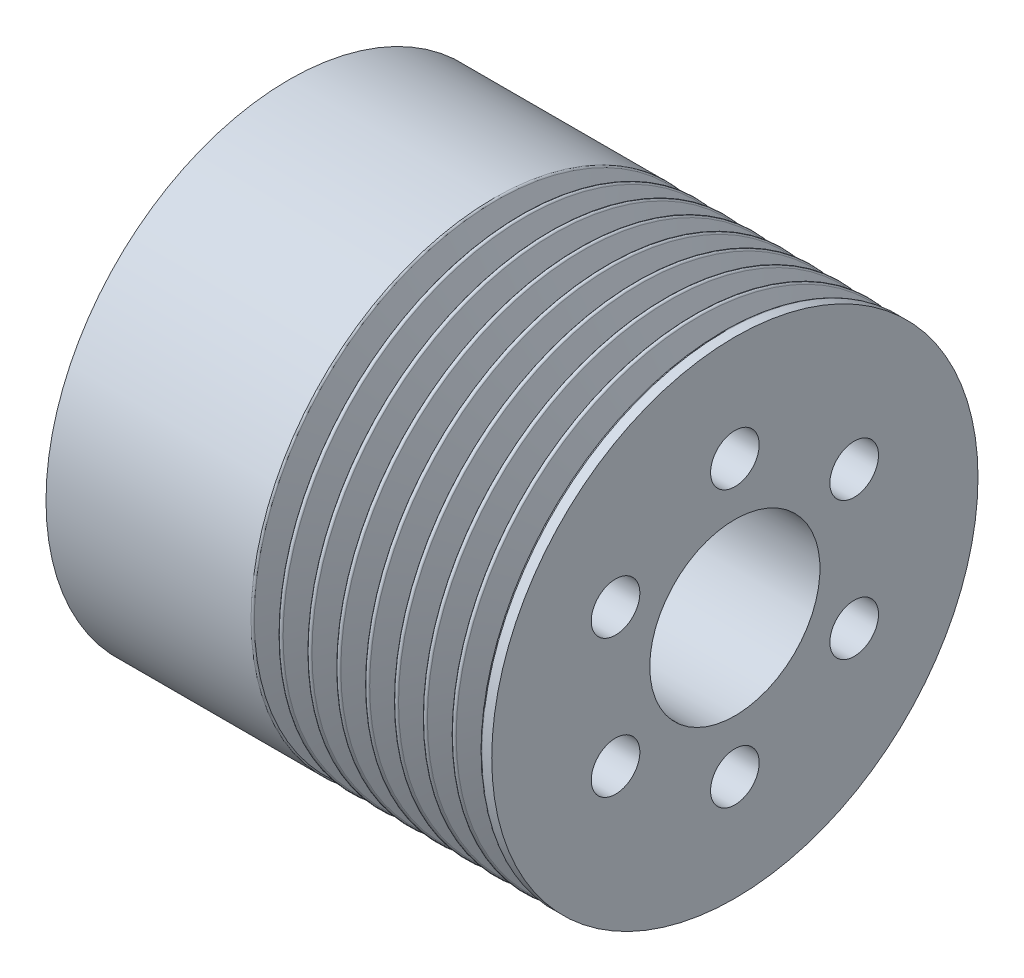
ISO-10303-21;
HEADER;
FILE_DESCRIPTION(('STEP AP214'),'2;1');
FILE_NAME('part.step','',(''),(''),'','','');
FILE_SCHEMA(('AUTOMOTIVE_DESIGN { 1 0 10303 214 1 1 1 1 }'));
ENDSEC;
DATA;
#1=APPLICATION_CONTEXT('core data for automotive mechanical design processes');
#2=APPLICATION_PROTOCOL_DEFINITION('international standard','automotive_design',2000,#1);
#3=PRODUCT_CONTEXT('',#1,'mechanical');
#4=PRODUCT('Part','Part','',(#3));
#5=PRODUCT_RELATED_PRODUCT_CATEGORY('part','',(#4));
#6=PRODUCT_DEFINITION_FORMATION('','',#4);
#7=PRODUCT_DEFINITION_CONTEXT('part definition',#1,'design');
#8=PRODUCT_DEFINITION('design','',#6,#7);
#9=PRODUCT_DEFINITION_SHAPE('','',#8);
#10=(LENGTH_UNIT() NAMED_UNIT(*) SI_UNIT(.MILLI.,.METRE.));
#11=(NAMED_UNIT(*) PLANE_ANGLE_UNIT() SI_UNIT($,.RADIAN.));
#12=(NAMED_UNIT(*) SI_UNIT($,.STERADIAN.) SOLID_ANGLE_UNIT());
#13=UNCERTAINTY_MEASURE_WITH_UNIT(LENGTH_MEASURE(1.E-05),#10,'distance_accuracy_value','');
#14=(GEOMETRIC_REPRESENTATION_CONTEXT(3) GLOBAL_UNCERTAINTY_ASSIGNED_CONTEXT((#13)) GLOBAL_UNIT_ASSIGNED_CONTEXT((#10,
#11,#12)) REPRESENTATION_CONTEXT('',''));
#15=CARTESIAN_POINT('',(0.,0.,0.));
#16=DIRECTION('',(0.,0.,1.));
#17=DIRECTION('',(1.,0.,0.));
#18=AXIS2_PLACEMENT_3D('',#15,#16,#17);
#19=CARTESIAN_POINT('',(0.,0.,0.));
#20=DIRECTION('',(-1.,0.,0.));
#21=DIRECTION('',(0.,0.,1.));
#22=AXIS2_PLACEMENT_3D('',#19,#20,#21);
#23=CYLINDRICAL_SURFACE('',#22,30.);
#24=CARTESIAN_POINT('',(-6.,0.,0.));
#25=DIRECTION('',(-1.,0.,0.));
#26=DIRECTION('',(0.,0.,1.));
#27=AXIS2_PLACEMENT_3D('',#24,#25,#26);
#28=CIRCLE('',#27,30.);
#29=CARTESIAN_POINT('',(-6.,0.,30.));
#30=VERTEX_POINT('',#29);
#31=EDGE_CURVE('E56',#30,#30,#28,.T.);
#32=ORIENTED_EDGE('',*,*,#31,.F.);
#33=EDGE_LOOP('',(#32));
#34=FACE_BOUND('',#33,.T.);
#35=CARTESIAN_POINT('',(19.3,0.,0.));
#36=DIRECTION('',(-1.,0.,0.));
#37=DIRECTION('',(0.,0.,1.));
#38=AXIS2_PLACEMENT_3D('',#35,#36,#37);
#39=CIRCLE('',#38,30.);
#40=CARTESIAN_POINT('',(19.3,0.,30.));
#41=VERTEX_POINT('',#40);
#42=EDGE_CURVE('E207',#41,#41,#39,.T.);
#43=ORIENTED_EDGE('',*,*,#42,.T.);
#44=EDGE_LOOP('',(#43));
#45=FACE_BOUND('',#44,.T.);
#46=ADVANCED_FACE('F43',(#34,#45),#23,.T.);
#47=CARTESIAN_POINT('',(31.5,10.5,0.));
#48=DIRECTION('',(1.,0.,0.));
#49=DIRECTION('',(0.,0.,-1.));
#50=AXIS2_PLACEMENT_3D('',#47,#48,#49);
#51=PLANE('',#50);
#52=CARTESIAN_POINT('',(31.5,8.50000000000017,14.7224318643354));
#53=DIRECTION('',(1.,0.,0.));
#54=DIRECTION('',(0.,0.,-1.));
#55=AXIS2_PLACEMENT_3D('',#52,#53,#54);
#56=CIRCLE('',#55,3.);
#57=CARTESIAN_POINT('',(31.5,8.50000000000017,11.7224318643354));
#58=VERTEX_POINT('',#57);
#59=EDGE_CURVE('E251',#58,#58,#56,.F.);
#60=ORIENTED_EDGE('',*,*,#59,.F.);
#61=EDGE_LOOP('',(#60));
#62=FACE_BOUND('',#61,.T.);
#63=CARTESIAN_POINT('',(31.5,-8.50000000000004,14.7224318643355));
#64=DIRECTION('',(1.,0.,0.));
#65=DIRECTION('',(0.,0.,-1.));
#66=AXIS2_PLACEMENT_3D('',#63,#64,#65);
#67=CIRCLE('',#66,3.);
#68=CARTESIAN_POINT('',(31.5,-8.50000000000004,11.7224318643355));
#69=VERTEX_POINT('',#68);
#70=EDGE_CURVE('E243',#69,#69,#67,.F.);
#71=ORIENTED_EDGE('',*,*,#70,.F.);
#72=EDGE_LOOP('',(#71));
#73=FACE_BOUND('',#72,.T.);
#74=CARTESIAN_POINT('',(31.5,-17.0000000000001,0.));
#75=DIRECTION('',(1.,0.,0.));
#76=DIRECTION('',(0.,0.,-1.));
#77=AXIS2_PLACEMENT_3D('',#74,#75,#76);
#78=CIRCLE('',#77,3.);
#79=CARTESIAN_POINT('',(31.5,-17.0000000000001,-2.99999999999996));
#80=VERTEX_POINT('',#79);
#81=EDGE_CURVE('E235',#80,#80,#78,.F.);
#82=ORIENTED_EDGE('',*,*,#81,.F.);
#83=EDGE_LOOP('',(#82));
#84=FACE_BOUND('',#83,.T.);
#85=CARTESIAN_POINT('',(31.5,-8.49999999999999,-14.7224318643355));
#86=DIRECTION('',(1.,0.,0.));
#87=DIRECTION('',(0.,0.,-1.));
#88=AXIS2_PLACEMENT_3D('',#85,#86,#87);
#89=CIRCLE('',#88,3.);
#90=CARTESIAN_POINT('',(31.5,-8.49999999999999,-17.7224318643355));
#91=VERTEX_POINT('',#90);
#92=EDGE_CURVE('E227',#91,#91,#89,.F.);
#93=ORIENTED_EDGE('',*,*,#92,.F.);
#94=EDGE_LOOP('',(#93));
#95=FACE_BOUND('',#94,.T.);
#96=CARTESIAN_POINT('',(31.5,8.5,-14.7224318643355));
#97=DIRECTION('',(1.,0.,0.));
#98=DIRECTION('',(0.,0.,-1.));
#99=AXIS2_PLACEMENT_3D('',#96,#97,#98);
#100=CIRCLE('',#99,3.);
#101=CARTESIAN_POINT('',(31.5,8.5,-17.7224318643355));
#102=VERTEX_POINT('',#101);
#103=EDGE_CURVE('E219',#102,#102,#100,.F.);
#104=ORIENTED_EDGE('',*,*,#103,.F.);
#105=EDGE_LOOP('',(#104));
#106=FACE_BOUND('',#105,.T.);
#107=CARTESIAN_POINT('',(31.5,17.,0.));
#108=DIRECTION('',(1.,0.,0.));
#109=DIRECTION('',(0.,0.,-1.));
#110=AXIS2_PLACEMENT_3D('',#107,#108,#109);
#111=CIRCLE('',#110,3.);
#112=CARTESIAN_POINT('',(31.5,17.,-3.));
#113=VERTEX_POINT('',#112);
#114=EDGE_CURVE('E211',#113,#113,#111,.F.);
#115=ORIENTED_EDGE('',*,*,#114,.F.);
#116=EDGE_LOOP('',(#115));
#117=FACE_BOUND('',#116,.T.);
#118=CARTESIAN_POINT('',(31.5,0.,0.));
#119=DIRECTION('',(-1.,0.,0.));
#120=DIRECTION('',(0.,0.,1.));
#121=AXIS2_PLACEMENT_3D('',#118,#119,#120);
#122=CIRCLE('',#121,10.5);
#123=CARTESIAN_POINT('',(31.5,0.,10.5));
#124=VERTEX_POINT('',#123);
#125=EDGE_CURVE('E71',#124,#124,#122,.T.);
#126=ORIENTED_EDGE('',*,*,#125,.F.);
#127=EDGE_LOOP('',(#126));
#128=FACE_BOUND('',#127,.T.);
#129=CARTESIAN_POINT('',(31.5,0.,0.));
#130=DIRECTION('',(-1.,0.,0.));
#131=DIRECTION('',(0.,0.,1.));
#132=AXIS2_PLACEMENT_3D('',#129,#130,#131);
#133=CIRCLE('',#132,21.5);
#134=CARTESIAN_POINT('',(31.5,0.,21.5));
#135=VERTEX_POINT('',#134);
#136=EDGE_CURVE('E10',#135,#135,#133,.T.);
#137=ORIENTED_EDGE('',*,*,#136,.T.);
#138=EDGE_LOOP('',(#137));
#139=FACE_BOUND('',#138,.T.);
#140=ADVANCED_FACE('F45',(#62,#73,#84,#95,#106,#117,#128,#139),#51,.F.);
#141=CARTESIAN_POINT('',(0.,0.,0.));
#142=DIRECTION('',(-1.,0.,0.));
#143=DIRECTION('',(0.,0.,1.));
#144=AXIS2_PLACEMENT_3D('',#141,#142,#143);
#145=CYLINDRICAL_SURFACE('',#144,21.5);
#146=ORIENTED_EDGE('',*,*,#136,.F.);
#147=EDGE_LOOP('',(#146));
#148=FACE_BOUND('',#147,.T.);
#149=CARTESIAN_POINT('',(-6.,0.,0.));
#150=DIRECTION('',(-1.,0.,0.));
#151=DIRECTION('',(0.,0.,1.));
#152=AXIS2_PLACEMENT_3D('',#149,#150,#151);
#153=CIRCLE('',#152,21.5);
#154=CARTESIAN_POINT('',(-6.,0.,21.5));
#155=VERTEX_POINT('',#154);
#156=EDGE_CURVE('E51',#155,#155,#153,.T.);
#157=ORIENTED_EDGE('',*,*,#156,.T.);
#158=EDGE_LOOP('',(#157));
#159=FACE_BOUND('',#158,.T.);
#160=ADVANCED_FACE('F289',(#148,#159),#145,.F.);
#161=CARTESIAN_POINT('',(-6.,30.,0.));
#162=DIRECTION('',(1.,0.,0.));
#163=DIRECTION('',(0.,0.,-1.));
#164=AXIS2_PLACEMENT_3D('',#161,#162,#163);
#165=PLANE('',#164);
#166=ORIENTED_EDGE('',*,*,#156,.F.);
#167=EDGE_LOOP('',(#166));
#168=FACE_BOUND('',#167,.T.);
#169=ORIENTED_EDGE('',*,*,#31,.T.);
#170=EDGE_LOOP('',(#169));
#171=FACE_BOUND('',#170,.T.);
#172=ADVANCED_FACE('F295',(#168,#171),#165,.F.);
#173=CARTESIAN_POINT('',(47.78,0.,0.));
#174=DIRECTION('',(-1.,0.,0.));
#175=DIRECTION('',(0.,0.,1.));
#176=AXIS2_PLACEMENT_3D('',#173,#174,#175);
#177=CIRCLE('',#176,30.);
#178=CARTESIAN_POINT('',(47.78,0.,30.));
#179=VERTEX_POINT('',#178);
#180=EDGE_CURVE('E91',#179,#179,#177,.T.);
#181=ORIENTED_EDGE('',*,*,#180,.F.);
#182=EDGE_LOOP('',(#181));
#183=FACE_BOUND('',#182,.T.);
#184=CARTESIAN_POINT('',(49.,0.,0.));
#185=DIRECTION('',(-1.,0.,0.));
#186=DIRECTION('',(0.,0.,1.));
#187=AXIS2_PLACEMENT_3D('',#184,#185,#186);
#188=CIRCLE('',#187,30.);
#189=CARTESIAN_POINT('',(49.,0.,30.));
#190=VERTEX_POINT('',#189);
#191=EDGE_CURVE('E61',#190,#190,#188,.T.);
#192=ORIENTED_EDGE('',*,*,#191,.T.);
#193=EDGE_LOOP('',(#192));
#194=FACE_BOUND('',#193,.T.);
#195=ADVANCED_FACE('F266',(#183,#194),#23,.T.);
#196=CARTESIAN_POINT('',(49.,10.5,0.));
#197=DIRECTION('',(-1.,0.,0.));
#198=DIRECTION('',(0.,0.,1.));
#199=AXIS2_PLACEMENT_3D('',#196,#197,#198);
#200=PLANE('',#199);
#201=CARTESIAN_POINT('',(49.,8.50000000000017,14.7224318643354));
#202=DIRECTION('',(1.,0.,0.));
#203=DIRECTION('',(0.,0.,-1.));
#204=AXIS2_PLACEMENT_3D('',#201,#202,#203);
#205=CIRCLE('',#204,3.);
#206=CARTESIAN_POINT('',(49.,8.50000000000017,11.7224318643354));
#207=VERTEX_POINT('',#206);
#208=EDGE_CURVE('E255',#207,#207,#205,.T.);
#209=ORIENTED_EDGE('',*,*,#208,.F.);
#210=EDGE_LOOP('',(#209));
#211=FACE_BOUND('',#210,.T.);
#212=CARTESIAN_POINT('',(49.,-8.50000000000004,14.7224318643355));
#213=DIRECTION('',(1.,0.,0.));
#214=DIRECTION('',(0.,0.,-1.));
#215=AXIS2_PLACEMENT_3D('',#212,#213,#214);
#216=CIRCLE('',#215,3.);
#217=CARTESIAN_POINT('',(49.,-8.50000000000004,11.7224318643355));
#218=VERTEX_POINT('',#217);
#219=EDGE_CURVE('E247',#218,#218,#216,.T.);
#220=ORIENTED_EDGE('',*,*,#219,.F.);
#221=EDGE_LOOP('',(#220));
#222=FACE_BOUND('',#221,.T.);
#223=CARTESIAN_POINT('',(49.,-17.0000000000001,0.));
#224=DIRECTION('',(1.,0.,0.));
#225=DIRECTION('',(0.,0.,-1.));
#226=AXIS2_PLACEMENT_3D('',#223,#224,#225);
#227=CIRCLE('',#226,3.);
#228=CARTESIAN_POINT('',(49.,-17.0000000000001,-2.99999999999996));
#229=VERTEX_POINT('',#228);
#230=EDGE_CURVE('E239',#229,#229,#227,.T.);
#231=ORIENTED_EDGE('',*,*,#230,.F.);
#232=EDGE_LOOP('',(#231));
#233=FACE_BOUND('',#232,.T.);
#234=CARTESIAN_POINT('',(49.,-8.49999999999999,-14.7224318643355));
#235=DIRECTION('',(1.,0.,0.));
#236=DIRECTION('',(0.,0.,-1.));
#237=AXIS2_PLACEMENT_3D('',#234,#235,#236);
#238=CIRCLE('',#237,3.);
#239=CARTESIAN_POINT('',(49.,-8.49999999999999,-17.7224318643355));
#240=VERTEX_POINT('',#239);
#241=EDGE_CURVE('E231',#240,#240,#238,.T.);
#242=ORIENTED_EDGE('',*,*,#241,.F.);
#243=EDGE_LOOP('',(#242));
#244=FACE_BOUND('',#243,.T.);
#245=CARTESIAN_POINT('',(49.,8.5,-14.7224318643355));
#246=DIRECTION('',(1.,0.,0.));
#247=DIRECTION('',(0.,0.,-1.));
#248=AXIS2_PLACEMENT_3D('',#245,#246,#247);
#249=CIRCLE('',#248,3.);
#250=CARTESIAN_POINT('',(49.,8.5,-17.7224318643355));
#251=VERTEX_POINT('',#250);
#252=EDGE_CURVE('E223',#251,#251,#249,.T.);
#253=ORIENTED_EDGE('',*,*,#252,.F.);
#254=EDGE_LOOP('',(#253));
#255=FACE_BOUND('',#254,.T.);
#256=CARTESIAN_POINT('',(49.,17.,0.));
#257=DIRECTION('',(1.,0.,0.));
#258=DIRECTION('',(0.,0.,-1.));
#259=AXIS2_PLACEMENT_3D('',#256,#257,#258);
#260=CIRCLE('',#259,3.);
#261=CARTESIAN_POINT('',(49.,17.,-3.));
#262=VERTEX_POINT('',#261);
#263=EDGE_CURVE('E215',#262,#262,#260,.T.);
#264=ORIENTED_EDGE('',*,*,#263,.F.);
#265=EDGE_LOOP('',(#264));
#266=FACE_BOUND('',#265,.T.);
#267=ORIENTED_EDGE('',*,*,#191,.F.);
#268=EDGE_LOOP('',(#267));
#269=FACE_BOUND('',#268,.T.);
#270=CARTESIAN_POINT('',(49.,0.,0.));
#271=DIRECTION('',(-1.,0.,0.));
#272=DIRECTION('',(0.,0.,1.));
#273=AXIS2_PLACEMENT_3D('',#270,#271,#272);
#274=CIRCLE('',#273,10.5);
#275=CARTESIAN_POINT('',(49.,0.,10.5));
#276=VERTEX_POINT('',#275);
#277=EDGE_CURVE('E67',#276,#276,#274,.T.);
#278=ORIENTED_EDGE('',*,*,#277,.T.);
#279=EDGE_LOOP('',(#278));
#280=FACE_BOUND('',#279,.T.);
#281=ADVANCED_FACE('F262',(#211,#222,#233,#244,#255,#266,#269,#280),#200,.F.);
#282=CARTESIAN_POINT('',(0.,0.,0.));
#283=DIRECTION('',(-1.,0.,0.));
#284=DIRECTION('',(0.,0.,1.));
#285=AXIS2_PLACEMENT_3D('',#282,#283,#284);
#286=CYLINDRICAL_SURFACE('',#285,10.5);
#287=ORIENTED_EDGE('',*,*,#277,.F.);
#288=EDGE_LOOP('',(#287));
#289=FACE_BOUND('',#288,.T.);
#290=ORIENTED_EDGE('',*,*,#125,.T.);
#291=EDGE_LOOP('',(#290));
#292=FACE_BOUND('',#291,.T.);
#293=ADVANCED_FACE('F265',(#289,#292),#286,.F.);
#294=CARTESIAN_POINT('',(47.78,0.,0.));
#295=DIRECTION('',(-1.,0.,0.));
#296=DIRECTION('',(0.,0.,1.));
#297=AXIS2_PLACEMENT_3D('',#294,#295,#296);
#298=TOROIDAL_SURFACE('',#297,29.75,0.250000000000001);
#299=ORIENTED_EDGE('',*,*,#180,.T.);
#300=EDGE_LOOP('',(#299));
#301=FACE_BOUND('',#300,.T.);
#302=CARTESIAN_POINT('',(47.5450768448035,0.,0.));
#303=DIRECTION('',(-1.,0.,0.));
#304=DIRECTION('',(0.,0.,1.));
#305=AXIS2_PLACEMENT_3D('',#302,#303,#304);
#306=CIRCLE('',#305,29.8355050358314);
#307=CARTESIAN_POINT('',(47.5450768448035,0.,29.8355050358314));
#308=VERTEX_POINT('',#307);
#309=EDGE_CURVE('E75',#308,#308,#306,.T.);
#310=ORIENTED_EDGE('',*,*,#309,.F.);
#311=EDGE_LOOP('',(#310));
#312=FACE_BOUND('',#311,.T.);
#313=ADVANCED_FACE('F284',(#301,#312),#298,.T.);
#314=CARTESIAN_POINT('',(46.2819077862358,0.,0.));
#315=DIRECTION('',(1.,0.,0.));
#316=DIRECTION('',(0.,0.,-1.));
#317=AXIS2_PLACEMENT_3D('',#314,#315,#316);
#318=CONICAL_SURFACE('',#317,26.3649765704627,1.22173047639603);
#319=ORIENTED_EDGE('',*,*,#309,.T.);
#320=EDGE_LOOP('',(#319));
#321=FACE_BOUND('',#320,.T.);
#322=CARTESIAN_POINT('',(46.2819077862358,0.,0.));
#323=DIRECTION('',(-1.,0.,0.));
#324=DIRECTION('',(0.,0.,1.));
#325=AXIS2_PLACEMENT_3D('',#322,#323,#324);
#326=CIRCLE('',#325,26.3649765704627);
#327=CARTESIAN_POINT('',(46.2819077862358,0.,26.3649765704627));
#328=VERTEX_POINT('',#327);
#329=EDGE_CURVE('E79',#328,#328,#326,.T.);
#330=ORIENTED_EDGE('',*,*,#329,.F.);
#331=EDGE_LOOP('',(#330));
#332=FACE_BOUND('',#331,.T.);
#333=ADVANCED_FACE('F447',(#321,#332),#318,.T.);
#334=CARTESIAN_POINT('',(46.,0.,0.));
#335=DIRECTION('',(-1.,0.,0.));
#336=DIRECTION('',(0.,0.,1.));
#337=AXIS2_PLACEMENT_3D('',#334,#335,#336);
#338=TOROIDAL_SURFACE('',#337,26.4675826134604,0.3);
#339=ORIENTED_EDGE('',*,*,#329,.T.);
#340=EDGE_LOOP('',(#339));
#341=FACE_BOUND('',#340,.T.);
#342=CARTESIAN_POINT('',(45.7180922137642,0.,0.));
#343=DIRECTION('',(-1.,0.,0.));
#344=DIRECTION('',(0.,0.,1.));
#345=AXIS2_PLACEMENT_3D('',#342,#343,#344);
#346=CIRCLE('',#345,26.3649765704627);
#347=CARTESIAN_POINT('',(45.7180922137642,0.,26.3649765704627));
#348=VERTEX_POINT('',#347);
#349=EDGE_CURVE('E83',#348,#348,#346,.T.);
#350=ORIENTED_EDGE('',*,*,#349,.F.);
#351=EDGE_LOOP('',(#350));
#352=FACE_BOUND('',#351,.T.);
#353=ADVANCED_FACE('F443',(#341,#352),#338,.F.);
#354=CARTESIAN_POINT('',(44.4549231551965,0.,0.));
#355=DIRECTION('',(-1.,0.,0.));
#356=DIRECTION('',(0.,0.,1.));
#357=AXIS2_PLACEMENT_3D('',#354,#355,#356);
#358=CONICAL_SURFACE('',#357,29.8355050358314,1.22173047639604);
#359=ORIENTED_EDGE('',*,*,#349,.T.);
#360=EDGE_LOOP('',(#359));
#361=FACE_BOUND('',#360,.T.);
#362=CARTESIAN_POINT('',(44.4549231551965,0.,0.));
#363=DIRECTION('',(-1.,0.,0.));
#364=DIRECTION('',(0.,0.,1.));
#365=AXIS2_PLACEMENT_3D('',#362,#363,#364);
#366=CIRCLE('',#365,29.8355050358314);
#367=CARTESIAN_POINT('',(44.4549231551965,0.,29.8355050358314));
#368=VERTEX_POINT('',#367);
#369=EDGE_CURVE('E87',#368,#368,#366,.T.);
#370=ORIENTED_EDGE('',*,*,#369,.F.);
#371=EDGE_LOOP('',(#370));
#372=FACE_BOUND('',#371,.T.);
#373=ADVANCED_FACE('F439',(#361,#372),#358,.T.);
#374=CARTESIAN_POINT('',(44.22,0.,0.));
#375=DIRECTION('',(-1.,0.,0.));
#376=DIRECTION('',(0.,0.,1.));
#377=AXIS2_PLACEMENT_3D('',#374,#375,#376);
#378=TOROIDAL_SURFACE('',#377,29.75,0.250000000000001);
#379=ORIENTED_EDGE('',*,*,#369,.T.);
#380=EDGE_LOOP('',(#379));
#381=FACE_BOUND('',#380,.T.);
#382=CARTESIAN_POINT('',(43.9850768448035,0.,0.));
#383=DIRECTION('',(-1.,0.,0.));
#384=DIRECTION('',(0.,0.,1.));
#385=AXIS2_PLACEMENT_3D('',#382,#383,#384);
#386=CIRCLE('',#385,29.8355050358314);
#387=CARTESIAN_POINT('',(43.9850768448035,0.,29.8355050358314));
#388=VERTEX_POINT('',#387);
#389=EDGE_CURVE('E95',#388,#388,#386,.T.);
#390=ORIENTED_EDGE('',*,*,#389,.F.);
#391=EDGE_LOOP('',(#390));
#392=FACE_BOUND('',#391,.T.);
#393=ADVANCED_FACE('F435',(#381,#392),#378,.T.);
#394=CARTESIAN_POINT('',(42.7219077862358,0.,0.));
#395=DIRECTION('',(1.,0.,0.));
#396=DIRECTION('',(0.,0.,-1.));
#397=AXIS2_PLACEMENT_3D('',#394,#395,#396);
#398=CONICAL_SURFACE('',#397,26.3649765704627,1.22173047639603);
#399=ORIENTED_EDGE('',*,*,#389,.T.);
#400=EDGE_LOOP('',(#399));
#401=FACE_BOUND('',#400,.T.);
#402=CARTESIAN_POINT('',(42.7219077862358,0.,0.));
#403=DIRECTION('',(-1.,0.,0.));
#404=DIRECTION('',(0.,0.,1.));
#405=AXIS2_PLACEMENT_3D('',#402,#403,#404);
#406=CIRCLE('',#405,26.3649765704627);
#407=CARTESIAN_POINT('',(42.7219077862358,0.,26.3649765704627));
#408=VERTEX_POINT('',#407);
#409=EDGE_CURVE('E99',#408,#408,#406,.T.);
#410=ORIENTED_EDGE('',*,*,#409,.F.);
#411=EDGE_LOOP('',(#410));
#412=FACE_BOUND('',#411,.T.);
#413=ADVANCED_FACE('F431',(#401,#412),#398,.T.);
#414=CARTESIAN_POINT('',(42.44,0.,0.));
#415=DIRECTION('',(-1.,0.,0.));
#416=DIRECTION('',(0.,0.,1.));
#417=AXIS2_PLACEMENT_3D('',#414,#415,#416);
#418=TOROIDAL_SURFACE('',#417,26.4675826134604,0.3);
#419=ORIENTED_EDGE('',*,*,#409,.T.);
#420=EDGE_LOOP('',(#419));
#421=FACE_BOUND('',#420,.T.);
#422=CARTESIAN_POINT('',(42.1580922137642,0.,0.));
#423=DIRECTION('',(-1.,0.,0.));
#424=DIRECTION('',(0.,0.,1.));
#425=AXIS2_PLACEMENT_3D('',#422,#423,#424);
#426=CIRCLE('',#425,26.3649765704627);
#427=CARTESIAN_POINT('',(42.1580922137642,0.,26.3649765704627));
#428=VERTEX_POINT('',#427);
#429=EDGE_CURVE('E103',#428,#428,#426,.T.);
#430=ORIENTED_EDGE('',*,*,#429,.F.);
#431=EDGE_LOOP('',(#430));
#432=FACE_BOUND('',#431,.T.);
#433=ADVANCED_FACE('F427',(#421,#432),#418,.F.);
#434=CARTESIAN_POINT('',(40.8949231551965,0.,0.));
#435=DIRECTION('',(-1.,0.,0.));
#436=DIRECTION('',(0.,0.,1.));
#437=AXIS2_PLACEMENT_3D('',#434,#435,#436);
#438=CONICAL_SURFACE('',#437,29.8355050358314,1.22173047639604);
#439=ORIENTED_EDGE('',*,*,#429,.T.);
#440=EDGE_LOOP('',(#439));
#441=FACE_BOUND('',#440,.T.);
#442=CARTESIAN_POINT('',(40.8949231551965,0.,0.));
#443=DIRECTION('',(-1.,0.,0.));
#444=DIRECTION('',(0.,0.,1.));
#445=AXIS2_PLACEMENT_3D('',#442,#443,#444);
#446=CIRCLE('',#445,29.8355050358314);
#447=CARTESIAN_POINT('',(40.8949231551965,0.,29.8355050358314));
#448=VERTEX_POINT('',#447);
#449=EDGE_CURVE('E107',#448,#448,#446,.T.);
#450=ORIENTED_EDGE('',*,*,#449,.F.);
#451=EDGE_LOOP('',(#450));
#452=FACE_BOUND('',#451,.T.);
#453=ADVANCED_FACE('F423',(#441,#452),#438,.T.);
#454=CARTESIAN_POINT('',(40.66,0.,0.));
#455=DIRECTION('',(-1.,0.,0.));
#456=DIRECTION('',(0.,0.,1.));
#457=AXIS2_PLACEMENT_3D('',#454,#455,#456);
#458=TOROIDAL_SURFACE('',#457,29.75,0.250000000000001);
#459=ORIENTED_EDGE('',*,*,#449,.T.);
#460=EDGE_LOOP('',(#459));
#461=FACE_BOUND('',#460,.T.);
#462=CARTESIAN_POINT('',(40.4250768448035,0.,0.));
#463=DIRECTION('',(-1.,0.,0.));
#464=DIRECTION('',(0.,0.,1.));
#465=AXIS2_PLACEMENT_3D('',#462,#463,#464);
#466=CIRCLE('',#465,29.8355050358314);
#467=CARTESIAN_POINT('',(40.4250768448035,0.,29.8355050358314));
#468=VERTEX_POINT('',#467);
#469=EDGE_CURVE('E111',#468,#468,#466,.T.);
#470=ORIENTED_EDGE('',*,*,#469,.F.);
#471=EDGE_LOOP('',(#470));
#472=FACE_BOUND('',#471,.T.);
#473=ADVANCED_FACE('F419',(#461,#472),#458,.T.);
#474=CARTESIAN_POINT('',(39.1619077862358,0.,0.));
#475=DIRECTION('',(1.,0.,0.));
#476=DIRECTION('',(0.,0.,-1.));
#477=AXIS2_PLACEMENT_3D('',#474,#475,#476);
#478=CONICAL_SURFACE('',#477,26.3649765704627,1.22173047639603);
#479=ORIENTED_EDGE('',*,*,#469,.T.);
#480=EDGE_LOOP('',(#479));
#481=FACE_BOUND('',#480,.T.);
#482=CARTESIAN_POINT('',(39.1619077862358,0.,0.));
#483=DIRECTION('',(-1.,0.,0.));
#484=DIRECTION('',(0.,0.,1.));
#485=AXIS2_PLACEMENT_3D('',#482,#483,#484);
#486=CIRCLE('',#485,26.3649765704627);
#487=CARTESIAN_POINT('',(39.1619077862358,0.,26.3649765704627));
#488=VERTEX_POINT('',#487);
#489=EDGE_CURVE('E115',#488,#488,#486,.T.);
#490=ORIENTED_EDGE('',*,*,#489,.F.);
#491=EDGE_LOOP('',(#490));
#492=FACE_BOUND('',#491,.T.);
#493=ADVANCED_FACE('F415',(#481,#492),#478,.T.);
#494=CARTESIAN_POINT('',(38.88,0.,0.));
#495=DIRECTION('',(-1.,0.,0.));
#496=DIRECTION('',(0.,0.,1.));
#497=AXIS2_PLACEMENT_3D('',#494,#495,#496);
#498=TOROIDAL_SURFACE('',#497,26.4675826134604,0.3);
#499=ORIENTED_EDGE('',*,*,#489,.T.);
#500=EDGE_LOOP('',(#499));
#501=FACE_BOUND('',#500,.T.);
#502=CARTESIAN_POINT('',(38.5980922137642,0.,0.));
#503=DIRECTION('',(-1.,0.,0.));
#504=DIRECTION('',(0.,0.,1.));
#505=AXIS2_PLACEMENT_3D('',#502,#503,#504);
#506=CIRCLE('',#505,26.3649765704627);
#507=CARTESIAN_POINT('',(38.5980922137642,0.,26.3649765704627));
#508=VERTEX_POINT('',#507);
#509=EDGE_CURVE('E119',#508,#508,#506,.T.);
#510=ORIENTED_EDGE('',*,*,#509,.F.);
#511=EDGE_LOOP('',(#510));
#512=FACE_BOUND('',#511,.T.);
#513=ADVANCED_FACE('F411',(#501,#512),#498,.F.);
#514=CARTESIAN_POINT('',(37.3349231551965,0.,0.));
#515=DIRECTION('',(-1.,0.,0.));
#516=DIRECTION('',(0.,0.,1.));
#517=AXIS2_PLACEMENT_3D('',#514,#515,#516);
#518=CONICAL_SURFACE('',#517,29.8355050358314,1.22173047639604);
#519=ORIENTED_EDGE('',*,*,#509,.T.);
#520=EDGE_LOOP('',(#519));
#521=FACE_BOUND('',#520,.T.);
#522=CARTESIAN_POINT('',(37.3349231551965,0.,0.));
#523=DIRECTION('',(-1.,0.,0.));
#524=DIRECTION('',(0.,0.,1.));
#525=AXIS2_PLACEMENT_3D('',#522,#523,#524);
#526=CIRCLE('',#525,29.8355050358314);
#527=CARTESIAN_POINT('',(37.3349231551965,0.,29.8355050358314));
#528=VERTEX_POINT('',#527);
#529=EDGE_CURVE('E123',#528,#528,#526,.T.);
#530=ORIENTED_EDGE('',*,*,#529,.F.);
#531=EDGE_LOOP('',(#530));
#532=FACE_BOUND('',#531,.T.);
#533=ADVANCED_FACE('F407',(#521,#532),#518,.T.);
#534=CARTESIAN_POINT('',(37.1,0.,0.));
#535=DIRECTION('',(-1.,0.,0.));
#536=DIRECTION('',(0.,0.,1.));
#537=AXIS2_PLACEMENT_3D('',#534,#535,#536);
#538=TOROIDAL_SURFACE('',#537,29.75,0.250000000000001);
#539=ORIENTED_EDGE('',*,*,#529,.T.);
#540=EDGE_LOOP('',(#539));
#541=FACE_BOUND('',#540,.T.);
#542=CARTESIAN_POINT('',(36.8650768448035,0.,0.));
#543=DIRECTION('',(-1.,0.,0.));
#544=DIRECTION('',(0.,0.,1.));
#545=AXIS2_PLACEMENT_3D('',#542,#543,#544);
#546=CIRCLE('',#545,29.8355050358314);
#547=CARTESIAN_POINT('',(36.8650768448035,0.,29.8355050358314));
#548=VERTEX_POINT('',#547);
#549=EDGE_CURVE('E127',#548,#548,#546,.T.);
#550=ORIENTED_EDGE('',*,*,#549,.F.);
#551=EDGE_LOOP('',(#550));
#552=FACE_BOUND('',#551,.T.);
#553=ADVANCED_FACE('F403',(#541,#552),#538,.T.);
#554=CARTESIAN_POINT('',(35.6019077862358,0.,0.));
#555=DIRECTION('',(1.,0.,0.));
#556=DIRECTION('',(0.,0.,-1.));
#557=AXIS2_PLACEMENT_3D('',#554,#555,#556);
#558=CONICAL_SURFACE('',#557,26.3649765704627,1.22173047639603);
#559=ORIENTED_EDGE('',*,*,#549,.T.);
#560=EDGE_LOOP('',(#559));
#561=FACE_BOUND('',#560,.T.);
#562=CARTESIAN_POINT('',(35.6019077862358,0.,0.));
#563=DIRECTION('',(-1.,0.,0.));
#564=DIRECTION('',(0.,0.,1.));
#565=AXIS2_PLACEMENT_3D('',#562,#563,#564);
#566=CIRCLE('',#565,26.3649765704627);
#567=CARTESIAN_POINT('',(35.6019077862358,0.,26.3649765704627));
#568=VERTEX_POINT('',#567);
#569=EDGE_CURVE('E131',#568,#568,#566,.T.);
#570=ORIENTED_EDGE('',*,*,#569,.F.);
#571=EDGE_LOOP('',(#570));
#572=FACE_BOUND('',#571,.T.);
#573=ADVANCED_FACE('F399',(#561,#572),#558,.T.);
#574=CARTESIAN_POINT('',(35.32,0.,0.));
#575=DIRECTION('',(-1.,0.,0.));
#576=DIRECTION('',(0.,0.,1.));
#577=AXIS2_PLACEMENT_3D('',#574,#575,#576);
#578=TOROIDAL_SURFACE('',#577,26.4675826134604,0.3);
#579=ORIENTED_EDGE('',*,*,#569,.T.);
#580=EDGE_LOOP('',(#579));
#581=FACE_BOUND('',#580,.T.);
#582=CARTESIAN_POINT('',(35.0380922137642,0.,0.));
#583=DIRECTION('',(-1.,0.,0.));
#584=DIRECTION('',(0.,0.,1.));
#585=AXIS2_PLACEMENT_3D('',#582,#583,#584);
#586=CIRCLE('',#585,26.3649765704627);
#587=CARTESIAN_POINT('',(35.0380922137642,0.,26.3649765704627));
#588=VERTEX_POINT('',#587);
#589=EDGE_CURVE('E135',#588,#588,#586,.T.);
#590=ORIENTED_EDGE('',*,*,#589,.F.);
#591=EDGE_LOOP('',(#590));
#592=FACE_BOUND('',#591,.T.);
#593=ADVANCED_FACE('F395',(#581,#592),#578,.F.);
#594=CARTESIAN_POINT('',(33.7749231551965,0.,0.));
#595=DIRECTION('',(-1.,0.,0.));
#596=DIRECTION('',(0.,0.,1.));
#597=AXIS2_PLACEMENT_3D('',#594,#595,#596);
#598=CONICAL_SURFACE('',#597,29.8355050358314,1.22173047639604);
#599=ORIENTED_EDGE('',*,*,#589,.T.);
#600=EDGE_LOOP('',(#599));
#601=FACE_BOUND('',#600,.T.);
#602=CARTESIAN_POINT('',(33.7749231551965,0.,0.));
#603=DIRECTION('',(-1.,0.,0.));
#604=DIRECTION('',(0.,0.,1.));
#605=AXIS2_PLACEMENT_3D('',#602,#603,#604);
#606=CIRCLE('',#605,29.8355050358314);
#607=CARTESIAN_POINT('',(33.7749231551965,0.,29.8355050358314));
#608=VERTEX_POINT('',#607);
#609=EDGE_CURVE('E139',#608,#608,#606,.T.);
#610=ORIENTED_EDGE('',*,*,#609,.F.);
#611=EDGE_LOOP('',(#610));
#612=FACE_BOUND('',#611,.T.);
#613=ADVANCED_FACE('F391',(#601,#612),#598,.T.);
#614=CARTESIAN_POINT('',(33.54,0.,0.));
#615=DIRECTION('',(-1.,0.,0.));
#616=DIRECTION('',(0.,0.,1.));
#617=AXIS2_PLACEMENT_3D('',#614,#615,#616);
#618=TOROIDAL_SURFACE('',#617,29.75,0.250000000000001);
#619=ORIENTED_EDGE('',*,*,#609,.T.);
#620=EDGE_LOOP('',(#619));
#621=FACE_BOUND('',#620,.T.);
#622=CARTESIAN_POINT('',(33.3050768448035,0.,0.));
#623=DIRECTION('',(-1.,0.,0.));
#624=DIRECTION('',(0.,0.,1.));
#625=AXIS2_PLACEMENT_3D('',#622,#623,#624);
#626=CIRCLE('',#625,29.8355050358314);
#627=CARTESIAN_POINT('',(33.3050768448035,0.,29.8355050358314));
#628=VERTEX_POINT('',#627);
#629=EDGE_CURVE('E143',#628,#628,#626,.T.);
#630=ORIENTED_EDGE('',*,*,#629,.F.);
#631=EDGE_LOOP('',(#630));
#632=FACE_BOUND('',#631,.T.);
#633=ADVANCED_FACE('F387',(#621,#632),#618,.T.);
#634=CARTESIAN_POINT('',(32.0419077862358,0.,0.));
#635=DIRECTION('',(1.,0.,0.));
#636=DIRECTION('',(0.,0.,-1.));
#637=AXIS2_PLACEMENT_3D('',#634,#635,#636);
#638=CONICAL_SURFACE('',#637,26.3649765704627,1.22173047639603);
#639=ORIENTED_EDGE('',*,*,#629,.T.);
#640=EDGE_LOOP('',(#639));
#641=FACE_BOUND('',#640,.T.);
#642=CARTESIAN_POINT('',(32.0419077862358,0.,0.));
#643=DIRECTION('',(-1.,0.,0.));
#644=DIRECTION('',(0.,0.,1.));
#645=AXIS2_PLACEMENT_3D('',#642,#643,#644);
#646=CIRCLE('',#645,26.3649765704627);
#647=CARTESIAN_POINT('',(32.0419077862358,0.,26.3649765704627));
#648=VERTEX_POINT('',#647);
#649=EDGE_CURVE('E147',#648,#648,#646,.T.);
#650=ORIENTED_EDGE('',*,*,#649,.F.);
#651=EDGE_LOOP('',(#650));
#652=FACE_BOUND('',#651,.T.);
#653=ADVANCED_FACE('F383',(#641,#652),#638,.T.);
#654=CARTESIAN_POINT('',(31.76,0.,0.));
#655=DIRECTION('',(-1.,0.,0.));
#656=DIRECTION('',(0.,0.,1.));
#657=AXIS2_PLACEMENT_3D('',#654,#655,#656);
#658=TOROIDAL_SURFACE('',#657,26.4675826134604,0.3);
#659=ORIENTED_EDGE('',*,*,#649,.T.);
#660=EDGE_LOOP('',(#659));
#661=FACE_BOUND('',#660,.T.);
#662=CARTESIAN_POINT('',(31.4780922137642,0.,0.));
#663=DIRECTION('',(-1.,0.,0.));
#664=DIRECTION('',(0.,0.,1.));
#665=AXIS2_PLACEMENT_3D('',#662,#663,#664);
#666=CIRCLE('',#665,26.3649765704627);
#667=CARTESIAN_POINT('',(31.4780922137642,0.,26.3649765704627));
#668=VERTEX_POINT('',#667);
#669=EDGE_CURVE('E151',#668,#668,#666,.T.);
#670=ORIENTED_EDGE('',*,*,#669,.F.);
#671=EDGE_LOOP('',(#670));
#672=FACE_BOUND('',#671,.T.);
#673=ADVANCED_FACE('F379',(#661,#672),#658,.F.);
#674=CARTESIAN_POINT('',(30.2149231551965,0.,0.));
#675=DIRECTION('',(-1.,0.,0.));
#676=DIRECTION('',(0.,0.,1.));
#677=AXIS2_PLACEMENT_3D('',#674,#675,#676);
#678=CONICAL_SURFACE('',#677,29.8355050358314,1.22173047639604);
#679=ORIENTED_EDGE('',*,*,#669,.T.);
#680=EDGE_LOOP('',(#679));
#681=FACE_BOUND('',#680,.T.);
#682=CARTESIAN_POINT('',(30.2149231551965,0.,0.));
#683=DIRECTION('',(-1.,0.,0.));
#684=DIRECTION('',(0.,0.,1.));
#685=AXIS2_PLACEMENT_3D('',#682,#683,#684);
#686=CIRCLE('',#685,29.8355050358314);
#687=CARTESIAN_POINT('',(30.2149231551965,0.,29.8355050358314));
#688=VERTEX_POINT('',#687);
#689=EDGE_CURVE('E155',#688,#688,#686,.T.);
#690=ORIENTED_EDGE('',*,*,#689,.F.);
#691=EDGE_LOOP('',(#690));
#692=FACE_BOUND('',#691,.T.);
#693=ADVANCED_FACE('F375',(#681,#692),#678,.T.);
#694=CARTESIAN_POINT('',(29.98,0.,0.));
#695=DIRECTION('',(-1.,0.,0.));
#696=DIRECTION('',(0.,0.,1.));
#697=AXIS2_PLACEMENT_3D('',#694,#695,#696);
#698=TOROIDAL_SURFACE('',#697,29.75,0.250000000000001);
#699=ORIENTED_EDGE('',*,*,#689,.T.);
#700=EDGE_LOOP('',(#699));
#701=FACE_BOUND('',#700,.T.);
#702=CARTESIAN_POINT('',(29.7450768448035,0.,0.));
#703=DIRECTION('',(-1.,0.,0.));
#704=DIRECTION('',(0.,0.,1.));
#705=AXIS2_PLACEMENT_3D('',#702,#703,#704);
#706=CIRCLE('',#705,29.8355050358314);
#707=CARTESIAN_POINT('',(29.7450768448035,0.,29.8355050358314));
#708=VERTEX_POINT('',#707);
#709=EDGE_CURVE('E159',#708,#708,#706,.T.);
#710=ORIENTED_EDGE('',*,*,#709,.F.);
#711=EDGE_LOOP('',(#710));
#712=FACE_BOUND('',#711,.T.);
#713=ADVANCED_FACE('F371',(#701,#712),#698,.T.);
#714=CARTESIAN_POINT('',(28.4819077862358,0.,0.));
#715=DIRECTION('',(1.,0.,0.));
#716=DIRECTION('',(0.,0.,-1.));
#717=AXIS2_PLACEMENT_3D('',#714,#715,#716);
#718=CONICAL_SURFACE('',#717,26.3649765704627,1.22173047639603);
#719=ORIENTED_EDGE('',*,*,#709,.T.);
#720=EDGE_LOOP('',(#719));
#721=FACE_BOUND('',#720,.T.);
#722=CARTESIAN_POINT('',(28.4819077862358,0.,0.));
#723=DIRECTION('',(-1.,0.,0.));
#724=DIRECTION('',(0.,0.,1.));
#725=AXIS2_PLACEMENT_3D('',#722,#723,#724);
#726=CIRCLE('',#725,26.3649765704627);
#727=CARTESIAN_POINT('',(28.4819077862358,0.,26.3649765704627));
#728=VERTEX_POINT('',#727);
#729=EDGE_CURVE('E163',#728,#728,#726,.T.);
#730=ORIENTED_EDGE('',*,*,#729,.F.);
#731=EDGE_LOOP('',(#730));
#732=FACE_BOUND('',#731,.T.);
#733=ADVANCED_FACE('F367',(#721,#732),#718,.T.);
#734=CARTESIAN_POINT('',(28.2,0.,0.));
#735=DIRECTION('',(-1.,0.,0.));
#736=DIRECTION('',(0.,0.,1.));
#737=AXIS2_PLACEMENT_3D('',#734,#735,#736);
#738=TOROIDAL_SURFACE('',#737,26.4675826134604,0.3);
#739=ORIENTED_EDGE('',*,*,#729,.T.);
#740=EDGE_LOOP('',(#739));
#741=FACE_BOUND('',#740,.T.);
#742=CARTESIAN_POINT('',(27.9180922137642,0.,0.));
#743=DIRECTION('',(-1.,0.,0.));
#744=DIRECTION('',(0.,0.,1.));
#745=AXIS2_PLACEMENT_3D('',#742,#743,#744);
#746=CIRCLE('',#745,26.3649765704627);
#747=CARTESIAN_POINT('',(27.9180922137642,0.,26.3649765704627));
#748=VERTEX_POINT('',#747);
#749=EDGE_CURVE('E167',#748,#748,#746,.T.);
#750=ORIENTED_EDGE('',*,*,#749,.F.);
#751=EDGE_LOOP('',(#750));
#752=FACE_BOUND('',#751,.T.);
#753=ADVANCED_FACE('F363',(#741,#752),#738,.F.);
#754=CARTESIAN_POINT('',(26.6549231551965,0.,0.));
#755=DIRECTION('',(-1.,0.,0.));
#756=DIRECTION('',(0.,0.,1.));
#757=AXIS2_PLACEMENT_3D('',#754,#755,#756);
#758=CONICAL_SURFACE('',#757,29.8355050358314,1.22173047639604);
#759=ORIENTED_EDGE('',*,*,#749,.T.);
#760=EDGE_LOOP('',(#759));
#761=FACE_BOUND('',#760,.T.);
#762=CARTESIAN_POINT('',(26.6549231551965,0.,0.));
#763=DIRECTION('',(-1.,0.,0.));
#764=DIRECTION('',(0.,0.,1.));
#765=AXIS2_PLACEMENT_3D('',#762,#763,#764);
#766=CIRCLE('',#765,29.8355050358314);
#767=CARTESIAN_POINT('',(26.6549231551965,0.,29.8355050358314));
#768=VERTEX_POINT('',#767);
#769=EDGE_CURVE('E171',#768,#768,#766,.T.);
#770=ORIENTED_EDGE('',*,*,#769,.F.);
#771=EDGE_LOOP('',(#770));
#772=FACE_BOUND('',#771,.T.);
#773=ADVANCED_FACE('F359',(#761,#772),#758,.T.);
#774=CARTESIAN_POINT('',(26.42,0.,0.));
#775=DIRECTION('',(-1.,0.,0.));
#776=DIRECTION('',(0.,0.,1.));
#777=AXIS2_PLACEMENT_3D('',#774,#775,#776);
#778=TOROIDAL_SURFACE('',#777,29.75,0.250000000000001);
#779=ORIENTED_EDGE('',*,*,#769,.T.);
#780=EDGE_LOOP('',(#779));
#781=FACE_BOUND('',#780,.T.);
#782=CARTESIAN_POINT('',(26.1850768448035,0.,0.));
#783=DIRECTION('',(-1.,0.,0.));
#784=DIRECTION('',(0.,0.,1.));
#785=AXIS2_PLACEMENT_3D('',#782,#783,#784);
#786=CIRCLE('',#785,29.8355050358314);
#787=CARTESIAN_POINT('',(26.1850768448035,0.,29.8355050358314));
#788=VERTEX_POINT('',#787);
#789=EDGE_CURVE('E175',#788,#788,#786,.T.);
#790=ORIENTED_EDGE('',*,*,#789,.F.);
#791=EDGE_LOOP('',(#790));
#792=FACE_BOUND('',#791,.T.);
#793=ADVANCED_FACE('F355',(#781,#792),#778,.T.);
#794=CARTESIAN_POINT('',(24.9219077862358,0.,0.));
#795=DIRECTION('',(1.,0.,0.));
#796=DIRECTION('',(0.,0.,-1.));
#797=AXIS2_PLACEMENT_3D('',#794,#795,#796);
#798=CONICAL_SURFACE('',#797,26.3649765704627,1.22173047639603);
#799=ORIENTED_EDGE('',*,*,#789,.T.);
#800=EDGE_LOOP('',(#799));
#801=FACE_BOUND('',#800,.T.);
#802=CARTESIAN_POINT('',(24.9219077862358,0.,0.));
#803=DIRECTION('',(-1.,0.,0.));
#804=DIRECTION('',(0.,0.,1.));
#805=AXIS2_PLACEMENT_3D('',#802,#803,#804);
#806=CIRCLE('',#805,26.3649765704627);
#807=CARTESIAN_POINT('',(24.9219077862358,0.,26.3649765704627));
#808=VERTEX_POINT('',#807);
#809=EDGE_CURVE('E179',#808,#808,#806,.T.);
#810=ORIENTED_EDGE('',*,*,#809,.F.);
#811=EDGE_LOOP('',(#810));
#812=FACE_BOUND('',#811,.T.);
#813=ADVANCED_FACE('F351',(#801,#812),#798,.T.);
#814=CARTESIAN_POINT('',(24.64,0.,0.));
#815=DIRECTION('',(-1.,0.,0.));
#816=DIRECTION('',(0.,0.,1.));
#817=AXIS2_PLACEMENT_3D('',#814,#815,#816);
#818=TOROIDAL_SURFACE('',#817,26.4675826134604,0.3);
#819=ORIENTED_EDGE('',*,*,#809,.T.);
#820=EDGE_LOOP('',(#819));
#821=FACE_BOUND('',#820,.T.);
#822=CARTESIAN_POINT('',(24.3580922137642,0.,0.));
#823=DIRECTION('',(-1.,0.,0.));
#824=DIRECTION('',(0.,0.,1.));
#825=AXIS2_PLACEMENT_3D('',#822,#823,#824);
#826=CIRCLE('',#825,26.3649765704627);
#827=CARTESIAN_POINT('',(24.3580922137642,0.,26.3649765704627));
#828=VERTEX_POINT('',#827);
#829=EDGE_CURVE('E183',#828,#828,#826,.T.);
#830=ORIENTED_EDGE('',*,*,#829,.F.);
#831=EDGE_LOOP('',(#830));
#832=FACE_BOUND('',#831,.T.);
#833=ADVANCED_FACE('F347',(#821,#832),#818,.F.);
#834=CARTESIAN_POINT('',(23.0949231551965,0.,0.));
#835=DIRECTION('',(-1.,0.,0.));
#836=DIRECTION('',(0.,0.,1.));
#837=AXIS2_PLACEMENT_3D('',#834,#835,#836);
#838=CONICAL_SURFACE('',#837,29.8355050358314,1.22173047639604);
#839=ORIENTED_EDGE('',*,*,#829,.T.);
#840=EDGE_LOOP('',(#839));
#841=FACE_BOUND('',#840,.T.);
#842=CARTESIAN_POINT('',(23.0949231551965,0.,0.));
#843=DIRECTION('',(-1.,0.,0.));
#844=DIRECTION('',(0.,0.,1.));
#845=AXIS2_PLACEMENT_3D('',#842,#843,#844);
#846=CIRCLE('',#845,29.8355050358314);
#847=CARTESIAN_POINT('',(23.0949231551965,0.,29.8355050358314));
#848=VERTEX_POINT('',#847);
#849=EDGE_CURVE('E187',#848,#848,#846,.T.);
#850=ORIENTED_EDGE('',*,*,#849,.F.);
#851=EDGE_LOOP('',(#850));
#852=FACE_BOUND('',#851,.T.);
#853=ADVANCED_FACE('F343',(#841,#852),#838,.T.);
#854=CARTESIAN_POINT('',(22.86,0.,0.));
#855=DIRECTION('',(-1.,0.,0.));
#856=DIRECTION('',(0.,0.,1.));
#857=AXIS2_PLACEMENT_3D('',#854,#855,#856);
#858=TOROIDAL_SURFACE('',#857,29.75,0.250000000000001);
#859=ORIENTED_EDGE('',*,*,#849,.T.);
#860=EDGE_LOOP('',(#859));
#861=FACE_BOUND('',#860,.T.);
#862=CARTESIAN_POINT('',(22.6250768448035,0.,0.));
#863=DIRECTION('',(-1.,0.,0.));
#864=DIRECTION('',(0.,0.,1.));
#865=AXIS2_PLACEMENT_3D('',#862,#863,#864);
#866=CIRCLE('',#865,29.8355050358314);
#867=CARTESIAN_POINT('',(22.6250768448035,0.,29.8355050358314));
#868=VERTEX_POINT('',#867);
#869=EDGE_CURVE('E191',#868,#868,#866,.T.);
#870=ORIENTED_EDGE('',*,*,#869,.F.);
#871=EDGE_LOOP('',(#870));
#872=FACE_BOUND('',#871,.T.);
#873=ADVANCED_FACE('F339',(#861,#872),#858,.T.);
#874=CARTESIAN_POINT('',(21.3619077862358,0.,0.));
#875=DIRECTION('',(1.,0.,0.));
#876=DIRECTION('',(0.,0.,-1.));
#877=AXIS2_PLACEMENT_3D('',#874,#875,#876);
#878=CONICAL_SURFACE('',#877,26.3649765704627,1.22173047639603);
#879=ORIENTED_EDGE('',*,*,#869,.T.);
#880=EDGE_LOOP('',(#879));
#881=FACE_BOUND('',#880,.T.);
#882=CARTESIAN_POINT('',(21.3619077862358,0.,0.));
#883=DIRECTION('',(-1.,0.,0.));
#884=DIRECTION('',(0.,0.,1.));
#885=AXIS2_PLACEMENT_3D('',#882,#883,#884);
#886=CIRCLE('',#885,26.3649765704627);
#887=CARTESIAN_POINT('',(21.3619077862358,0.,26.3649765704627));
#888=VERTEX_POINT('',#887);
#889=EDGE_CURVE('E195',#888,#888,#886,.T.);
#890=ORIENTED_EDGE('',*,*,#889,.F.);
#891=EDGE_LOOP('',(#890));
#892=FACE_BOUND('',#891,.T.);
#893=ADVANCED_FACE('F335',(#881,#892),#878,.T.);
#894=CARTESIAN_POINT('',(21.08,0.,0.));
#895=DIRECTION('',(-1.,0.,0.));
#896=DIRECTION('',(0.,0.,1.));
#897=AXIS2_PLACEMENT_3D('',#894,#895,#896);
#898=TOROIDAL_SURFACE('',#897,26.4675826134604,0.3);
#899=ORIENTED_EDGE('',*,*,#889,.T.);
#900=EDGE_LOOP('',(#899));
#901=FACE_BOUND('',#900,.T.);
#902=CARTESIAN_POINT('',(20.7980922137642,0.,0.));
#903=DIRECTION('',(-1.,0.,0.));
#904=DIRECTION('',(0.,0.,1.));
#905=AXIS2_PLACEMENT_3D('',#902,#903,#904);
#906=CIRCLE('',#905,26.3649765704627);
#907=CARTESIAN_POINT('',(20.7980922137642,0.,26.3649765704627));
#908=VERTEX_POINT('',#907);
#909=EDGE_CURVE('E199',#908,#908,#906,.T.);
#910=ORIENTED_EDGE('',*,*,#909,.F.);
#911=EDGE_LOOP('',(#910));
#912=FACE_BOUND('',#911,.T.);
#913=ADVANCED_FACE('F331',(#901,#912),#898,.F.);
#914=CARTESIAN_POINT('',(19.5349231551965,0.,0.));
#915=DIRECTION('',(-1.,0.,0.));
#916=DIRECTION('',(0.,0.,1.));
#917=AXIS2_PLACEMENT_3D('',#914,#915,#916);
#918=CONICAL_SURFACE('',#917,29.8355050358314,1.22173047639604);
#919=ORIENTED_EDGE('',*,*,#909,.T.);
#920=EDGE_LOOP('',(#919));
#921=FACE_BOUND('',#920,.T.);
#922=CARTESIAN_POINT('',(19.5349231551965,0.,0.));
#923=DIRECTION('',(-1.,0.,0.));
#924=DIRECTION('',(0.,0.,1.));
#925=AXIS2_PLACEMENT_3D('',#922,#923,#924);
#926=CIRCLE('',#925,29.8355050358314);
#927=CARTESIAN_POINT('',(19.5349231551965,0.,29.8355050358314));
#928=VERTEX_POINT('',#927);
#929=EDGE_CURVE('E203',#928,#928,#926,.T.);
#930=ORIENTED_EDGE('',*,*,#929,.F.);
#931=EDGE_LOOP('',(#930));
#932=FACE_BOUND('',#931,.T.);
#933=ADVANCED_FACE('F324',(#921,#932),#918,.T.);
#934=CARTESIAN_POINT('',(19.3,0.,0.));
#935=DIRECTION('',(-1.,0.,0.));
#936=DIRECTION('',(0.,0.,1.));
#937=AXIS2_PLACEMENT_3D('',#934,#935,#936);
#938=TOROIDAL_SURFACE('',#937,29.75,0.250000000000001);
#939=ORIENTED_EDGE('',*,*,#929,.T.);
#940=EDGE_LOOP('',(#939));
#941=FACE_BOUND('',#940,.T.);
#942=ORIENTED_EDGE('',*,*,#42,.F.);
#943=EDGE_LOOP('',(#942));
#944=FACE_BOUND('',#943,.T.);
#945=ADVANCED_FACE('F315',(#941,#944),#938,.T.);
#946=CARTESIAN_POINT('',(23.0147186257614,17.,0.));
#947=DIRECTION('',(1.,0.,0.));
#948=DIRECTION('',(0.,0.,-1.));
#949=AXIS2_PLACEMENT_3D('',#946,#947,#948);
#950=CYLINDRICAL_SURFACE('',#949,3.);
#951=ORIENTED_EDGE('',*,*,#114,.T.);
#952=EDGE_LOOP('',(#951));
#953=FACE_BOUND('',#952,.T.);
#954=ORIENTED_EDGE('',*,*,#263,.T.);
#955=EDGE_LOOP('',(#954));
#956=FACE_BOUND('',#955,.T.);
#957=ADVANCED_FACE('F311',(#953,#956),#950,.F.);
#958=CARTESIAN_POINT('',(23.0147186257614,8.5,-14.7224318643355));
#959=DIRECTION('',(1.,0.,0.));
#960=DIRECTION('',(0.,0.,-1.));
#961=AXIS2_PLACEMENT_3D('',#958,#959,#960);
#962=CYLINDRICAL_SURFACE('',#961,3.);
#963=ORIENTED_EDGE('',*,*,#103,.T.);
#964=EDGE_LOOP('',(#963));
#965=FACE_BOUND('',#964,.T.);
#966=ORIENTED_EDGE('',*,*,#252,.T.);
#967=EDGE_LOOP('',(#966));
#968=FACE_BOUND('',#967,.T.);
#969=ADVANCED_FACE('F314',(#965,#968),#962,.F.);
#970=CARTESIAN_POINT('',(23.0147186257614,-8.49999999999999,-14.7224318643355));
#971=DIRECTION('',(1.,0.,0.));
#972=DIRECTION('',(0.,0.,-1.));
#973=AXIS2_PLACEMENT_3D('',#970,#971,#972);
#974=CYLINDRICAL_SURFACE('',#973,3.);
#975=ORIENTED_EDGE('',*,*,#92,.T.);
#976=EDGE_LOOP('',(#975));
#977=FACE_BOUND('',#976,.T.);
#978=ORIENTED_EDGE('',*,*,#241,.T.);
#979=EDGE_LOOP('',(#978));
#980=FACE_BOUND('',#979,.T.);
#981=ADVANCED_FACE('F321',(#977,#980),#974,.F.);
#982=CARTESIAN_POINT('',(23.0147186257614,-17.0000000000001,0.));
#983=DIRECTION('',(1.,0.,0.));
#984=DIRECTION('',(0.,0.,-1.));
#985=AXIS2_PLACEMENT_3D('',#982,#983,#984);
#986=CYLINDRICAL_SURFACE('',#985,3.);
#987=ORIENTED_EDGE('',*,*,#81,.T.);
#988=EDGE_LOOP('',(#987));
#989=FACE_BOUND('',#988,.T.);
#990=ORIENTED_EDGE('',*,*,#230,.T.);
#991=EDGE_LOOP('',(#990));
#992=FACE_BOUND('',#991,.T.);
#993=ADVANCED_FACE('F591',(#989,#992),#986,.F.);
#994=CARTESIAN_POINT('',(23.0147186257614,-8.50000000000004,14.7224318643355));
#995=DIRECTION('',(1.,0.,0.));
#996=DIRECTION('',(0.,0.,-1.));
#997=AXIS2_PLACEMENT_3D('',#994,#995,#996);
#998=CYLINDRICAL_SURFACE('',#997,3.);
#999=ORIENTED_EDGE('',*,*,#70,.T.);
#1000=EDGE_LOOP('',(#999));
#1001=FACE_BOUND('',#1000,.T.);
#1002=ORIENTED_EDGE('',*,*,#219,.T.);
#1003=EDGE_LOOP('',(#1002));
#1004=FACE_BOUND('',#1003,.T.);
#1005=ADVANCED_FACE('F599',(#1001,#1004),#998,.F.);
#1006=CARTESIAN_POINT('',(23.0147186257614,8.50000000000017,14.7224318643354));
#1007=DIRECTION('',(1.,0.,0.));
#1008=DIRECTION('',(0.,0.,-1.));
#1009=AXIS2_PLACEMENT_3D('',#1006,#1007,#1008);
#1010=CYLINDRICAL_SURFACE('',#1009,3.);
#1011=ORIENTED_EDGE('',*,*,#59,.T.);
#1012=EDGE_LOOP('',(#1011));
#1013=FACE_BOUND('',#1012,.T.);
#1014=ORIENTED_EDGE('',*,*,#208,.T.);
#1015=EDGE_LOOP('',(#1014));
#1016=FACE_BOUND('',#1015,.T.);
#1017=ADVANCED_FACE('F260',(#1013,#1016),#1010,.F.);
#1018=CLOSED_SHELL('',(#46,#140,#160,#172,#195,#281,#293,#313,#333,#353,#373,#393,#413,#433,
#453,#473,#493,#513,#533,#553,#573,#593,#613,#633,#653,#673,#693,#713,#733,#753,#773,#793,#813,
#833,#853,#873,#893,#913,#933,#945,#957,#969,#981,#993,#1005,#1017));
#1019=MANIFOLD_SOLID_BREP('B2',#1018);
#1020=ADVANCED_BREP_SHAPE_REPRESENTATION('',(#18,#1019),#14);
#1021=SHAPE_DEFINITION_REPRESENTATION(#9,#1020);
ENDSEC;
END-ISO-10303-21;
